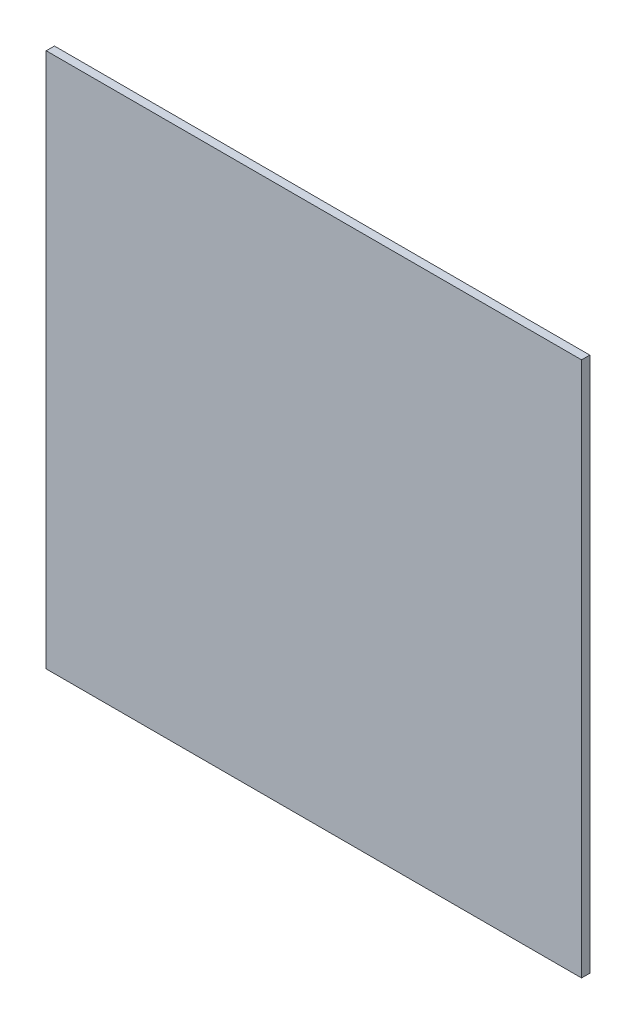
ISO-10303-21;
HEADER;
FILE_DESCRIPTION(('STEP AP214'),'2;1');
FILE_NAME('part.step','',(''),(''),'','','');
FILE_SCHEMA(('AUTOMOTIVE_DESIGN { 1 0 10303 214 1 1 1 1 }'));
ENDSEC;
DATA;
#1=APPLICATION_CONTEXT('core data for automotive mechanical design processes');
#2=APPLICATION_PROTOCOL_DEFINITION('international standard','automotive_design',2000,#1);
#3=PRODUCT_CONTEXT('',#1,'mechanical');
#4=PRODUCT('Part','Part','',(#3));
#5=PRODUCT_RELATED_PRODUCT_CATEGORY('part','',(#4));
#6=PRODUCT_DEFINITION_FORMATION('','',#4);
#7=PRODUCT_DEFINITION_CONTEXT('part definition',#1,'design');
#8=PRODUCT_DEFINITION('design','',#6,#7);
#9=PRODUCT_DEFINITION_SHAPE('','',#8);
#10=(LENGTH_UNIT() NAMED_UNIT(*) SI_UNIT(.MILLI.,.METRE.));
#11=(NAMED_UNIT(*) PLANE_ANGLE_UNIT() SI_UNIT($,.RADIAN.));
#12=(NAMED_UNIT(*) SI_UNIT($,.STERADIAN.) SOLID_ANGLE_UNIT());
#13=UNCERTAINTY_MEASURE_WITH_UNIT(LENGTH_MEASURE(1.E-05),#10,'distance_accuracy_value','');
#14=(GEOMETRIC_REPRESENTATION_CONTEXT(3) GLOBAL_UNCERTAINTY_ASSIGNED_CONTEXT((#13)) GLOBAL_UNIT_ASSIGNED_CONTEXT((#10,
#11,#12)) REPRESENTATION_CONTEXT('',''));
#15=CARTESIAN_POINT('',(0.,0.,0.));
#16=DIRECTION('',(0.,0.,1.));
#17=DIRECTION('',(1.,0.,0.));
#18=AXIS2_PLACEMENT_3D('',#15,#16,#17);
#19=CARTESIAN_POINT('',(-17.7021276595745,18.186170212766,0.5));
#20=DIRECTION('',(1.,0.,0.));
#21=DIRECTION('',(0.,1.,0.));
#22=AXIS2_PLACEMENT_3D('',#19,#20,#21);
#23=PLANE('',#22);
#24=DIRECTION('',(0.,-1.,0.));
#25=VECTOR('',#24,1.);
#26=CARTESIAN_POINT('',(-17.7021276595745,18.186170212766,0.));
#27=LINE('',#26,#25);
#28=CARTESIAN_POINT('',(-17.7021276595745,18.186170212766,0.));
#29=VERTEX_POINT('',#28);
#30=CARTESIAN_POINT('',(-17.7021276595745,-14.313829787234,0.));
#31=VERTEX_POINT('',#30);
#32=EDGE_CURVE('E113',#29,#31,#27,.T.);
#33=ORIENTED_EDGE('',*,*,#32,.T.);
#34=DIRECTION('',(0.,0.,-1.));
#35=VECTOR('',#34,1.);
#36=CARTESIAN_POINT('',(-17.7021276595745,-14.313829787234,0.5));
#37=LINE('',#36,#35);
#38=CARTESIAN_POINT('',(-17.7021276595745,-14.313829787234,0.5));
#39=VERTEX_POINT('',#38);
#40=EDGE_CURVE('E11',#39,#31,#37,.T.);
#41=ORIENTED_EDGE('',*,*,#40,.F.);
#42=DIRECTION('',(0.,-1.,0.));
#43=VECTOR('',#42,1.);
#44=CARTESIAN_POINT('',(-17.7021276595745,18.186170212766,0.5));
#45=LINE('',#44,#43);
#46=CARTESIAN_POINT('',(-17.7021276595745,18.186170212766,0.5));
#47=VERTEX_POINT('',#46);
#48=EDGE_CURVE('E97',#47,#39,#45,.T.);
#49=ORIENTED_EDGE('',*,*,#48,.F.);
#50=DIRECTION('',(0.,0.,-1.));
#51=VECTOR('',#50,1.);
#52=CARTESIAN_POINT('',(-17.7021276595745,18.186170212766,0.5));
#53=LINE('',#52,#51);
#54=EDGE_CURVE('E109',#47,#29,#53,.T.);
#55=ORIENTED_EDGE('',*,*,#54,.T.);
#56=EDGE_LOOP('',(#33,#41,#49,#55));
#57=FACE_BOUND('',#56,.T.);
#58=ADVANCED_FACE('F45',(#57),#23,.F.);
#59=CARTESIAN_POINT('',(-17.7021276595745,-14.313829787234,0.5));
#60=DIRECTION('',(0.,1.,0.));
#61=DIRECTION('',(0.,0.,1.));
#62=AXIS2_PLACEMENT_3D('',#59,#60,#61);
#63=PLANE('',#62);
#64=DIRECTION('',(1.,0.,0.));
#65=VECTOR('',#64,1.);
#66=CARTESIAN_POINT('',(-17.7021276595745,-14.313829787234,0.));
#67=LINE('',#66,#65);
#68=CARTESIAN_POINT('',(14.7978723404255,-14.313829787234,0.));
#69=VERTEX_POINT('',#68);
#70=EDGE_CURVE('E102',#31,#69,#67,.T.);
#71=ORIENTED_EDGE('',*,*,#70,.T.);
#72=DIRECTION('',(0.,0.,-1.));
#73=VECTOR('',#72,1.);
#74=CARTESIAN_POINT('',(14.7978723404255,-14.313829787234,0.5));
#75=LINE('',#74,#73);
#76=CARTESIAN_POINT('',(14.7978723404255,-14.313829787234,0.5));
#77=VERTEX_POINT('',#76);
#78=EDGE_CURVE('E54',#77,#69,#75,.T.);
#79=ORIENTED_EDGE('',*,*,#78,.F.);
#80=DIRECTION('',(1.,0.,0.));
#81=VECTOR('',#80,1.);
#82=CARTESIAN_POINT('',(-17.7021276595745,-14.313829787234,0.5));
#83=LINE('',#82,#81);
#84=EDGE_CURVE('E92',#39,#77,#83,.T.);
#85=ORIENTED_EDGE('',*,*,#84,.F.);
#86=ORIENTED_EDGE('',*,*,#40,.T.);
#87=EDGE_LOOP('',(#71,#79,#85,#86));
#88=FACE_BOUND('',#87,.T.);
#89=ADVANCED_FACE('F101',(#88),#63,.F.);
#90=CARTESIAN_POINT('',(14.7978723404255,18.186170212766,0.5));
#91=DIRECTION('',(-1.,0.,0.));
#92=DIRECTION('',(0.,-1.,0.));
#93=AXIS2_PLACEMENT_3D('',#90,#91,#92);
#94=PLANE('',#93);
#95=DIRECTION('',(0.,1.,0.));
#96=VECTOR('',#95,1.);
#97=CARTESIAN_POINT('',(14.7978723404255,18.186170212766,0.));
#98=LINE('',#97,#96);
#99=CARTESIAN_POINT('',(14.7978723404255,18.186170212766,0.));
#100=VERTEX_POINT('',#99);
#101=EDGE_CURVE('E79',#69,#100,#98,.T.);
#102=ORIENTED_EDGE('',*,*,#101,.T.);
#103=DIRECTION('',(0.,0.,-1.));
#104=VECTOR('',#103,1.);
#105=CARTESIAN_POINT('',(14.7978723404255,18.186170212766,0.5));
#106=LINE('',#105,#104);
#107=CARTESIAN_POINT('',(14.7978723404255,18.186170212766,0.5));
#108=VERTEX_POINT('',#107);
#109=EDGE_CURVE('E104',#108,#100,#106,.T.);
#110=ORIENTED_EDGE('',*,*,#109,.F.);
#111=DIRECTION('',(0.,1.,0.));
#112=VECTOR('',#111,1.);
#113=CARTESIAN_POINT('',(14.7978723404255,18.186170212766,0.5));
#114=LINE('',#113,#112);
#115=EDGE_CURVE('E95',#77,#108,#114,.T.);
#116=ORIENTED_EDGE('',*,*,#115,.F.);
#117=ORIENTED_EDGE('',*,*,#78,.T.);
#118=EDGE_LOOP('',(#102,#110,#116,#117));
#119=FACE_BOUND('',#118,.T.);
#120=ADVANCED_FACE('F105',(#119),#94,.F.);
#121=CARTESIAN_POINT('',(-17.7021276595745,18.186170212766,0.5));
#122=DIRECTION('',(0.,-1.,0.));
#123=DIRECTION('',(0.,0.,-1.));
#124=AXIS2_PLACEMENT_3D('',#121,#122,#123);
#125=PLANE('',#124);
#126=DIRECTION('',(-1.,0.,0.));
#127=VECTOR('',#126,1.);
#128=CARTESIAN_POINT('',(-17.7021276595745,18.186170212766,0.));
#129=LINE('',#128,#127);
#130=EDGE_CURVE('E85',#100,#29,#129,.T.);
#131=ORIENTED_EDGE('',*,*,#130,.T.);
#132=ORIENTED_EDGE('',*,*,#54,.F.);
#133=DIRECTION('',(-1.,0.,0.));
#134=VECTOR('',#133,1.);
#135=CARTESIAN_POINT('',(-17.7021276595745,18.186170212766,0.5));
#136=LINE('',#135,#134);
#137=EDGE_CURVE('E62',#108,#47,#136,.T.);
#138=ORIENTED_EDGE('',*,*,#137,.F.);
#139=ORIENTED_EDGE('',*,*,#109,.T.);
#140=EDGE_LOOP('',(#131,#132,#138,#139));
#141=FACE_BOUND('',#140,.T.);
#142=ADVANCED_FACE('F126',(#141),#125,.F.);
#143=CARTESIAN_POINT('',(0.,0.,0.5));
#144=DIRECTION('',(0.,0.,1.));
#145=DIRECTION('',(1.,0.,0.));
#146=AXIS2_PLACEMENT_3D('',#143,#144,#145);
#147=PLANE('',#146);
#148=ORIENTED_EDGE('',*,*,#48,.T.);
#149=ORIENTED_EDGE('',*,*,#84,.T.);
#150=ORIENTED_EDGE('',*,*,#115,.T.);
#151=ORIENTED_EDGE('',*,*,#137,.T.);
#152=EDGE_LOOP('',(#148,#149,#150,#151));
#153=FACE_BOUND('',#152,.T.);
#154=ADVANCED_FACE('F93',(#153),#147,.T.);
#155=CARTESIAN_POINT('',(0.,0.,0.));
#156=DIRECTION('',(0.,0.,1.));
#157=DIRECTION('',(1.,0.,0.));
#158=AXIS2_PLACEMENT_3D('',#155,#156,#157);
#159=PLANE('',#158);
#160=ORIENTED_EDGE('',*,*,#32,.F.);
#161=ORIENTED_EDGE('',*,*,#130,.F.);
#162=ORIENTED_EDGE('',*,*,#101,.F.);
#163=ORIENTED_EDGE('',*,*,#70,.F.);
#164=EDGE_LOOP('',(#160,#161,#162,#163));
#165=FACE_BOUND('',#164,.T.);
#166=ADVANCED_FACE('F129',(#165),#159,.F.);
#167=CLOSED_SHELL('',(#58,#89,#120,#142,#154,#166));
#168=MANIFOLD_SOLID_BREP('B2',#167);
#169=ADVANCED_BREP_SHAPE_REPRESENTATION('',(#18,#168),#14);
#170=SHAPE_DEFINITION_REPRESENTATION(#9,#169);
ENDSEC;
END-ISO-10303-21;
